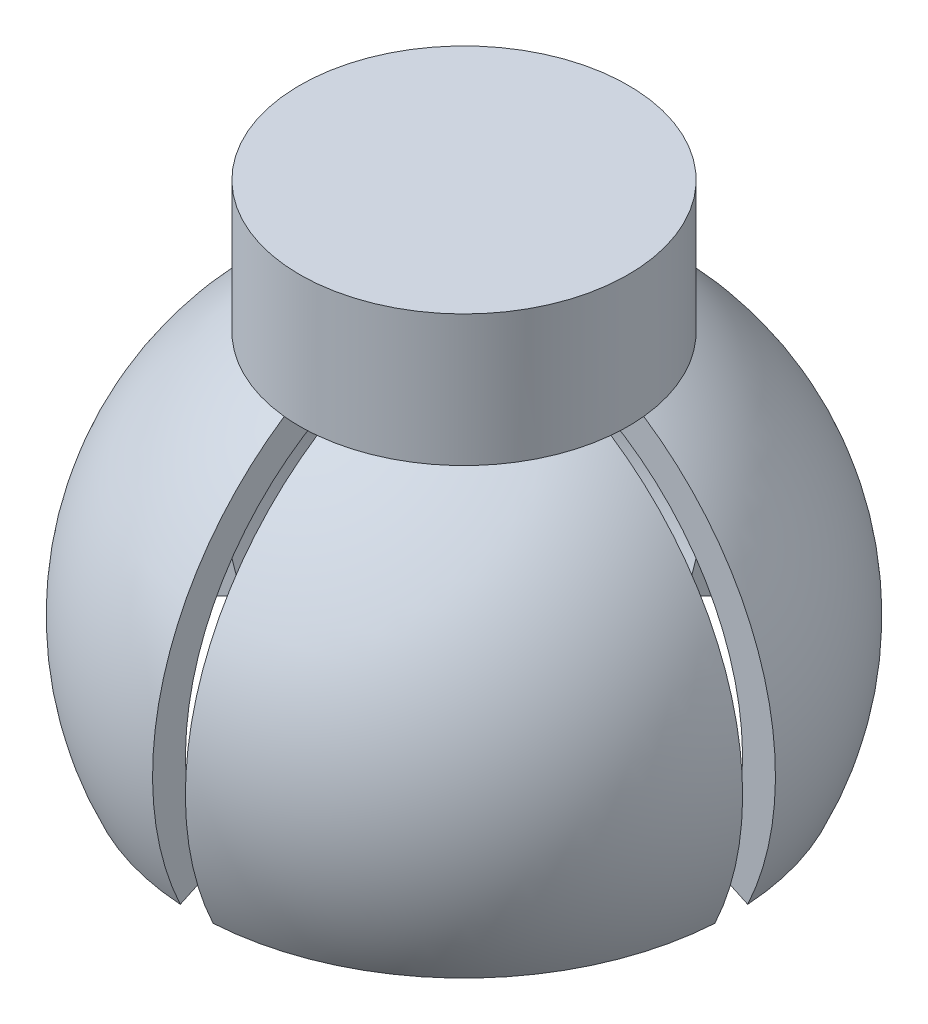
ISO-10303-21;
HEADER;
FILE_DESCRIPTION(('STEP AP214'),'2;1');
FILE_NAME('part.step','',(''),(''),'','','');
FILE_SCHEMA(('AUTOMOTIVE_DESIGN { 1 0 10303 214 1 1 1 1 }'));
ENDSEC;
DATA;
#1=APPLICATION_CONTEXT('core data for automotive mechanical design processes');
#2=APPLICATION_PROTOCOL_DEFINITION('international standard','automotive_design',2000,#1);
#3=PRODUCT_CONTEXT('',#1,'mechanical');
#4=PRODUCT('Part','Part','',(#3));
#5=PRODUCT_RELATED_PRODUCT_CATEGORY('part','',(#4));
#6=PRODUCT_DEFINITION_FORMATION('','',#4);
#7=PRODUCT_DEFINITION_CONTEXT('part definition',#1,'design');
#8=PRODUCT_DEFINITION('design','',#6,#7);
#9=PRODUCT_DEFINITION_SHAPE('','',#8);
#10=(LENGTH_UNIT() NAMED_UNIT(*) SI_UNIT(.MILLI.,.METRE.));
#11=(NAMED_UNIT(*) PLANE_ANGLE_UNIT() SI_UNIT($,.RADIAN.));
#12=(NAMED_UNIT(*) SI_UNIT($,.STERADIAN.) SOLID_ANGLE_UNIT());
#13=UNCERTAINTY_MEASURE_WITH_UNIT(LENGTH_MEASURE(1.E-05),#10,'distance_accuracy_value','');
#14=(GEOMETRIC_REPRESENTATION_CONTEXT(3) GLOBAL_UNCERTAINTY_ASSIGNED_CONTEXT((#13)) GLOBAL_UNIT_ASSIGNED_CONTEXT((#10,
#11,#12)) REPRESENTATION_CONTEXT('',''));
#15=CARTESIAN_POINT('',(0.,0.,0.));
#16=DIRECTION('',(0.,0.,1.));
#17=DIRECTION('',(1.,0.,0.));
#18=AXIS2_PLACEMENT_3D('',#15,#16,#17);
#19=CARTESIAN_POINT('',(0.,-1.6904730469628,0.));
#20=DIRECTION('',(0.,-1.,0.));
#21=DIRECTION('',(0.,0.,-1.));
#22=AXIS2_PLACEMENT_3D('',#19,#20,#21);
#23=CONICAL_SURFACE('',#22,3.6252311481466,1.13446401379632);
#24=CARTESIAN_POINT('',(0.,-1.90178217783315,0.));
#25=DIRECTION('',(0.,1.,0.));
#26=DIRECTION('',(0.,0.,1.));
#27=AXIS2_PLACEMENT_3D('',#24,#25,#26);
#28=CIRCLE('',#27,4.07838504166492);
#29=CARTESIAN_POINT('',(-4.07071548355767,-1.90178217783315,0.250000000000014));
#30=VERTEX_POINT('',#29);
#31=CARTESIAN_POINT('',(-0.25,-1.90178217783315,4.07071548355767));
#32=VERTEX_POINT('',#31);
#33=EDGE_CURVE('E258',#30,#32,#28,.T.);
#34=ORIENTED_EDGE('',*,*,#33,.F.);
#35=CARTESIAN_POINT('',(-4.07221946565592,-1.90248217783315,0.250000000000014));
#36=CARTESIAN_POINT('',(-3.94567931737871,-1.84358642240399,0.250000000000014));
#37=CARTESIAN_POINT('',(-3.81913532048379,-1.78469893906311,0.250000000000014));
#38=CARTESIAN_POINT('',(-3.56603630607503,-1.66694675751874,0.250000000000013));
#39=CARTESIAN_POINT('',(-3.43948128853205,-1.6080820593779,0.250000000000012));
#40=CARTESIAN_POINT('',(-3.05967010023294,-1.43147355775673,0.250000000000011));
#41=CARTESIAN_POINT('',(-2.80639342267716,-1.31377383417764,0.25000000000001));
#42=CARTESIAN_POINT('',(-2.41675898173911,-1.13295021974366,0.250000000000009));
#43=CARTESIAN_POINT('',(-2.28044403311834,-1.06973411557903,0.250000000000008));
#44=CARTESIAN_POINT('',(-2.00775268940997,-0.943431734209146,0.250000000000007));
#45=CARTESIAN_POINT('',(-1.8713762938373,-0.880345458051456,0.250000000000007));
#46=CARTESIAN_POINT('',(-1.59858338414994,-0.75443503519734,0.250000000000006));
#47=CARTESIAN_POINT('',(-1.46216692247366,-0.691610775162603,0.250000000000005));
#48=CARTESIAN_POINT('',(-1.25736353267224,-0.597767490056621,0.250000000000005));
#49=CARTESIAN_POINT('',(-1.18906656722934,-0.566552191028818,0.250000000000004));
#50=CARTESIAN_POINT('',(-1.05237420482607,-0.504338014735132,0.250000000000004));
#51=CARTESIAN_POINT('',(-0.983978808314685,-0.473339136485799,0.250000000000004));
#52=CARTESIAN_POINT('',(-0.855614359830246,-0.415597512203695,0.250000000000003));
#53=CARTESIAN_POINT('',(-0.795665807128812,-0.388809168509848,0.250000000000003));
#54=CARTESIAN_POINT('',(-0.675472957354786,-0.335732884921152,0.250000000000002));
#55=CARTESIAN_POINT('',(-0.61522842343024,-0.309445475553456,0.250000000000002));
#56=CARTESIAN_POINT('',(-0.52506498014929,-0.271120949374287,0.250000000000002));
#57=CARTESIAN_POINT('',(-0.49533245434838,-0.258646616199561,0.250000000000002));
#58=CARTESIAN_POINT('',(-0.435686198997284,-0.234140586402541,0.250000000000002));
#59=CARTESIAN_POINT('',(-0.405772482269082,-0.222108858875767,0.250000000000002));
#60=CARTESIAN_POINT('',(-0.345697431835928,-0.198785670253055,0.250000000000001));
#61=CARTESIAN_POINT('',(-0.315536431927215,-0.187493352493365,0.250000000000001));
#62=CARTESIAN_POINT('',(-0.254773254160907,-0.166179763521121,0.250000000000001));
#63=CARTESIAN_POINT('',(-0.224171405356725,-0.156157593968867,0.250000000000001));
#64=CARTESIAN_POINT('',(-0.17748728721053,-0.142853405188922,0.250000000000001));
#65=CARTESIAN_POINT('',(-0.16166302037817,-0.138680043758284,0.250000000000001));
#66=CARTESIAN_POINT('',(-0.129823790456269,-0.131200750430565,0.250000000000001));
#67=CARTESIAN_POINT('',(-0.113809044577812,-0.127893914121724,0.250000000000001));
#68=CARTESIAN_POINT('',(-0.0814749207414367,-0.122412053874023,0.25));
#69=CARTESIAN_POINT('',(-0.065154260976988,-0.120244271684003,0.25));
#70=CARTESIAN_POINT('',(-0.0323290703377821,-0.117299522118081,0.25));
#71=CARTESIAN_POINT('',(-0.0158240780716583,-0.11652783265685,0.25));
#72=CARTESIAN_POINT('',(0.000700000000000861,-0.116577371519382,0.25));
#73=B_SPLINE_CURVE_WITH_KNOTS('',3,(#35,#36,#37,#38,#39,#40,#41,#42,#43,#44,#45,#46,#47,#48,#49,
#50,#51,#52,#53,#54,#55,#56,#57,#58,#59,#60,#61,#62,#63,#64,#65,#66,#67,#68,#69,#70,#71,#72),
.UNSPECIFIED.,.F.,.F.,(4,2,2,2,2,2,2,2,2,2,2,2,2,2,2,2,2,2,4),(0.,0.41872433554745,
0.837449814219395,1.67531650004867,2.12609617541748,2.57687947391954,3.0274417943241,
3.25271890904912,3.47799499941387,3.67497934292895,3.87216185630467,3.9688900640857,
4.06561150505052,4.16221882798374,4.2587574373911,4.30783604281648,4.35686321790836,
4.40619843202635,4.45571977075776),.UNSPECIFIED.);
#74=CARTESIAN_POINT('',(-3.61660073515066,-1.6904730469628,0.250000000000013));
#75=VERTEX_POINT('',#74);
#76=EDGE_CURVE('E182',#30,#75,#73,.T.);
#77=ORIENTED_EDGE('',*,*,#76,.T.);
#78=CARTESIAN_POINT('',(0.,-1.6904730469628,0.));
#79=DIRECTION('',(0.,1.,0.));
#80=DIRECTION('',(0.,0.,1.));
#81=AXIS2_PLACEMENT_3D('',#78,#79,#80);
#82=CIRCLE('',#81,3.6252311481466);
#83=CARTESIAN_POINT('',(-0.25,-1.6904730469628,3.61660073515066));
#84=VERTEX_POINT('',#83);
#85=EDGE_CURVE('E179',#75,#84,#82,.T.);
#86=ORIENTED_EDGE('',*,*,#85,.T.);
#87=CARTESIAN_POINT('',(-0.25,-0.116577371519382,-0.0007));
#88=CARTESIAN_POINT('',(-0.25,-0.116521368230406,0.0167694577942829));
#89=CARTESIAN_POINT('',(-0.25,-0.117387675628831,0.0342142321475056));
#90=CARTESIAN_POINT('',(-0.25,-0.120671271474661,0.0688866459002576));
#91=CARTESIAN_POINT('',(-0.25,-0.123081964092508,0.0861148925185828));
#92=CARTESIAN_POINT('',(-0.25,-0.129146177088828,0.120229894791217));
#93=CARTESIAN_POINT('',(-0.25,-0.132791875242166,0.13711810784319));
#94=CARTESIAN_POINT('',(-0.25,-0.14100019992691,0.170686937001528));
#95=CARTESIAN_POINT('',(-0.25,-0.145563941428522,0.187367274225319));
#96=CARTESIAN_POINT('',(-0.25,-0.160044091183051,0.236523281885804));
#97=CARTESIAN_POINT('',(-0.25,-0.170879228982749,0.268723854380891));
#98=CARTESIAN_POINT('',(-0.25,-0.193819688373075,0.332674007480803));
#99=CARTESIAN_POINT('',(-0.25,-0.205925868144774,0.364423266731945));
#100=CARTESIAN_POINT('',(-0.25,-0.230865782278105,0.427670148883238));
#101=CARTESIAN_POINT('',(-0.25,-0.243700221632976,0.459167493074044));
#102=CARTESIAN_POINT('',(-0.25,-0.269801042284863,0.52198330457912));
#103=CARTESIAN_POINT('',(-0.25,-0.28306745084794,0.553301760454662));
#104=CARTESIAN_POINT('',(-0.25,-0.323769319525987,0.648250734509752));
#105=CARTESIAN_POINT('',(-0.25,-0.351627548428421,0.711699561803441));
#106=CARTESIAN_POINT('',(-0.25,-0.407829330780213,0.838311787720637));
#107=CARTESIAN_POINT('',(-0.25,-0.436172428513183,0.901475390668849));
#108=CARTESIAN_POINT('',(-0.25,-0.525259785883231,1.09886878378826));
#109=CARTESIAN_POINT('',(-0.25,-0.586484310826681,1.23288168488988));
#110=CARTESIAN_POINT('',(-0.25,-0.709359583895897,1.50071338046139));
#111=CARTESIAN_POINT('',(-0.25,-0.771010339733947,1.63453217136574));
#112=CARTESIAN_POINT('',(-0.25,-0.894559849125209,1.90212538535859));
#113=CARTESIAN_POINT('',(-0.25,-0.956458698077464,2.03589976449549));
#114=CARTESIAN_POINT('',(-0.25,-1.08037491021281,2.30339245029184));
#115=CARTESIAN_POINT('',(-0.25,-1.14239227261557,2.43711075731346));
#116=CARTESIAN_POINT('',(-0.25,-1.32064235124045,2.82117984424759));
#117=CARTESIAN_POINT('',(-0.25,-1.43696284724913,3.07148989045622));
#118=CARTESIAN_POINT('',(-0.25,-1.66968114880864,3.57194065521046));
#119=CARTESIAN_POINT('',(-0.25,-1.78607889814608,3.82208139989095));
#120=CARTESIAN_POINT('',(-0.25,-1.90248217783315,4.07221946565592));
#121=B_SPLINE_CURVE_WITH_KNOTS('',3,(#87,#88,#89,#90,#91,#92,#93,#94,#95,#96,#97,#98,#99,#100,
#101,#102,#103,#104,#105,#106,#107,#108,#109,#110,#111,#112,#113,#114,#115,#116,#117,#118,#119,
#120),.UNSPECIFIED.,.F.,.F.,(4,2,2,2,2,2,2,2,2,2,2,2,2,2,2,2,4),(0.,0.0523449225379201,
0.10446776502531,0.156266461966652,0.208128452796367,0.309988028330286,0.411916825071337,
0.513946035826806,0.615981699237264,0.823860853748743,1.03155433097493,1.47355858361078,
1.91557085497632,2.35777355272897,2.79997334885453,3.6280253125037,4.45571442114346),.UNSPECIFIED.);
#122=EDGE_CURVE('E259',#84,#32,#121,.T.);
#123=ORIENTED_EDGE('',*,*,#122,.T.);
#124=EDGE_LOOP('',(#34,#77,#86,#123));
#125=FACE_BOUND('',#124,.T.);
#126=ADVANCED_FACE('F39',(#125),#23,.F.);
#127=CARTESIAN_POINT('',(0.25,-1.90178217783315,4.07071548355767));
#128=VERTEX_POINT('',#127);
#129=CARTESIAN_POINT('',(4.07071548355768,-1.90178217783315,0.249999999999958));
#130=VERTEX_POINT('',#129);
#131=EDGE_CURVE('E263',#128,#130,#28,.T.);
#132=ORIENTED_EDGE('',*,*,#131,.F.);
#133=CARTESIAN_POINT('',(0.25,-1.90248217783315,4.07221946565592));
#134=CARTESIAN_POINT('',(0.25,-1.84358642240399,3.94567931737871));
#135=CARTESIAN_POINT('',(0.25,-1.78469893906311,3.81913532048379));
#136=CARTESIAN_POINT('',(0.25,-1.66694675751874,3.56603630607503));
#137=CARTESIAN_POINT('',(0.25,-1.6080820593779,3.43948128853205));
#138=CARTESIAN_POINT('',(0.25,-1.43147355775673,3.05967010023294));
#139=CARTESIAN_POINT('',(0.25,-1.31377383417764,2.80639342267715));
#140=CARTESIAN_POINT('',(0.25,-1.13295021974366,2.41675898173911));
#141=CARTESIAN_POINT('',(0.25,-1.06973411557903,2.28044403311834));
#142=CARTESIAN_POINT('',(0.25,-0.943431734209145,2.00775268940997));
#143=CARTESIAN_POINT('',(0.25,-0.880345458051456,1.8713762938373));
#144=CARTESIAN_POINT('',(0.25,-0.75443503519734,1.59858338414994));
#145=CARTESIAN_POINT('',(0.25,-0.691610775162603,1.46216692247366));
#146=CARTESIAN_POINT('',(0.25,-0.597767490056621,1.25736353267224));
#147=CARTESIAN_POINT('',(0.25,-0.566552191028818,1.18906656722935));
#148=CARTESIAN_POINT('',(0.25,-0.504338014735132,1.05237420482607));
#149=CARTESIAN_POINT('',(0.25,-0.4733391364858,0.983978808314686));
#150=CARTESIAN_POINT('',(0.25,-0.415597512203695,0.855614359830247));
#151=CARTESIAN_POINT('',(0.25,-0.388809168509848,0.795665807128813));
#152=CARTESIAN_POINT('',(0.25,-0.335732884921152,0.675472957354787));
#153=CARTESIAN_POINT('',(0.25,-0.309445475553455,0.615228423430241));
#154=CARTESIAN_POINT('',(0.25,-0.271120949374286,0.52506498014929));
#155=CARTESIAN_POINT('',(0.25,-0.258646616199561,0.49533245434838));
#156=CARTESIAN_POINT('',(0.25,-0.234140586402541,0.435686198997284));
#157=CARTESIAN_POINT('',(0.25,-0.222108858875766,0.405772482269082));
#158=CARTESIAN_POINT('',(0.25,-0.198785670253055,0.345697431835928));
#159=CARTESIAN_POINT('',(0.25,-0.187493352493365,0.315536431927215));
#160=CARTESIAN_POINT('',(0.25,-0.166179763521121,0.254773254160908));
#161=CARTESIAN_POINT('',(0.25,-0.156157593968868,0.224171405356726));
#162=CARTESIAN_POINT('',(0.25,-0.142853405188922,0.177487287210531));
#163=CARTESIAN_POINT('',(0.25,-0.138680043758284,0.161663020378171));
#164=CARTESIAN_POINT('',(0.25,-0.131200750430565,0.129823790456271));
#165=CARTESIAN_POINT('',(0.25,-0.127893914121724,0.113809044577813));
#166=CARTESIAN_POINT('',(0.25,-0.122412053874023,0.0814749207414378));
#167=CARTESIAN_POINT('',(0.25,-0.120244271684003,0.0651542609769893));
#168=CARTESIAN_POINT('',(0.25,-0.117299522118081,0.0323290703377834));
#169=CARTESIAN_POINT('',(0.25,-0.11652783265685,0.0158240780716595));
#170=CARTESIAN_POINT('',(0.25,-0.116577371519382,-0.000699999999999942));
#171=B_SPLINE_CURVE_WITH_KNOTS('',3,(#133,#134,#135,#136,#137,#138,#139,#140,#141,#142,#143,
#144,#145,#146,#147,#148,#149,#150,#151,#152,#153,#154,#155,#156,#157,#158,#159,#160,#161,#162,
#163,#164,#165,#166,#167,#168,#169,#170),.UNSPECIFIED.,.F.,.F.,(4,2,2,2,2,2,2,2,2,2,2,2,2,2,2,2,
2,2,4),(0.,0.41872433554745,0.837449814219395,1.67531650004867,2.12609617541748,
2.57687947391954,3.0274417943241,3.25271890904912,3.47799499941387,3.67497934292895,
3.87216185630467,3.9688900640857,4.06561150505052,4.16221882798373,4.2587574373911,
4.30783604281648,4.35686321790835,4.40619843202635,4.45571977075776),.UNSPECIFIED.);
#172=CARTESIAN_POINT('',(0.25,-1.6904730469628,3.61660073515066));
#173=VERTEX_POINT('',#172);
#174=EDGE_CURVE('E404',#128,#173,#171,.T.);
#175=ORIENTED_EDGE('',*,*,#174,.T.);
#176=CARTESIAN_POINT('',(3.61660073515066,-1.6904730469628,0.249999999999962));
#177=VERTEX_POINT('',#176);
#178=EDGE_CURVE('E423',#173,#177,#82,.T.);
#179=ORIENTED_EDGE('',*,*,#178,.T.);
#180=CARTESIAN_POINT('',(-0.000699999999997381,-0.116577371519382,0.25));
#181=CARTESIAN_POINT('',(0.0167694577942855,-0.116521368230406,0.25));
#182=CARTESIAN_POINT('',(0.0342142321475082,-0.117387675628831,0.25));
#183=CARTESIAN_POINT('',(0.0688866459002603,-0.120671271474661,0.249999999999999));
#184=CARTESIAN_POINT('',(0.0861148925185854,-0.123081964092508,0.249999999999999));
#185=CARTESIAN_POINT('',(0.12022989479122,-0.129146177088828,0.249999999999999));
#186=CARTESIAN_POINT('',(0.137118107843192,-0.132791875242166,0.249999999999999));
#187=CARTESIAN_POINT('',(0.170686937001531,-0.14100019992691,0.249999999999998));
#188=CARTESIAN_POINT('',(0.187367274225322,-0.145563941428522,0.249999999999998));
#189=CARTESIAN_POINT('',(0.236523281885807,-0.160044091183051,0.249999999999998));
#190=CARTESIAN_POINT('',(0.268723854380893,-0.170879228982749,0.249999999999997));
#191=CARTESIAN_POINT('',(0.332674007480806,-0.193819688373075,0.249999999999997));
#192=CARTESIAN_POINT('',(0.364423266731948,-0.205925868144774,0.249999999999996));
#193=CARTESIAN_POINT('',(0.427670148883241,-0.230865782278104,0.249999999999996));
#194=CARTESIAN_POINT('',(0.459167493074047,-0.243700221632976,0.249999999999995));
#195=CARTESIAN_POINT('',(0.521983304579123,-0.269801042284863,0.249999999999995));
#196=CARTESIAN_POINT('',(0.553301760454665,-0.28306745084794,0.249999999999994));
#197=CARTESIAN_POINT('',(0.648250734509754,-0.323769319525987,0.249999999999993));
#198=CARTESIAN_POINT('',(0.711699561803444,-0.351627548428421,0.249999999999993));
#199=CARTESIAN_POINT('',(0.838311787720639,-0.407829330780213,0.249999999999991));
#200=CARTESIAN_POINT('',(0.901475390668852,-0.436172428513183,0.249999999999991));
#201=CARTESIAN_POINT('',(1.09886878378827,-0.525259785883231,0.249999999999989));
#202=CARTESIAN_POINT('',(1.23288168488988,-0.586484310826681,0.249999999999987));
#203=CARTESIAN_POINT('',(1.50071338046139,-0.709359583895897,0.249999999999984));
#204=CARTESIAN_POINT('',(1.63453217136574,-0.771010339733946,0.249999999999983));
#205=CARTESIAN_POINT('',(1.90212538535859,-0.894559849125208,0.24999999999998));
#206=CARTESIAN_POINT('',(2.03589976449549,-0.956458698077463,0.249999999999979));
#207=CARTESIAN_POINT('',(2.30339245029184,-1.08037491021281,0.249999999999976));
#208=CARTESIAN_POINT('',(2.43711075731346,-1.14239227261557,0.249999999999975));
#209=CARTESIAN_POINT('',(2.82117984424759,-1.32064235124045,0.249999999999971));
#210=CARTESIAN_POINT('',(3.07148989045622,-1.43696284724913,0.249999999999968));
#211=CARTESIAN_POINT('',(3.57194065521046,-1.66968114880864,0.249999999999963));
#212=CARTESIAN_POINT('',(3.82208139989095,-1.78607889814608,0.24999999999996));
#213=CARTESIAN_POINT('',(4.07221946565592,-1.90248217783315,0.249999999999958));
#214=B_SPLINE_CURVE_WITH_KNOTS('',3,(#180,#181,#182,#183,#184,#185,#186,#187,#188,#189,#190,
#191,#192,#193,#194,#195,#196,#197,#198,#199,#200,#201,#202,#203,#204,#205,#206,#207,#208,#209,
#210,#211,#212,#213),.UNSPECIFIED.,.F.,.F.,(4,2,2,2,2,2,2,2,2,2,2,2,2,2,2,2,4),(0.,
0.0523449225379202,0.10446776502531,0.156266461966652,0.208128452796367,0.309988028330286,
0.411916825071337,0.513946035826805,0.615981699237264,0.823860853748743,1.03155433097493,
1.47355858361078,1.91557085497632,2.35777355272896,2.79997334885453,3.6280253125037,
4.45571442114346),.UNSPECIFIED.);
#215=EDGE_CURVE('E164',#177,#130,#214,.T.);
#216=ORIENTED_EDGE('',*,*,#215,.T.);
#217=EDGE_LOOP('',(#132,#175,#179,#216));
#218=FACE_BOUND('',#217,.T.);
#219=ADVANCED_FACE('F249',(#218),#23,.F.);
#220=CARTESIAN_POINT('',(4.07071548355767,-1.90178217783315,-0.250000000000014));
#221=VERTEX_POINT('',#220);
#222=CARTESIAN_POINT('',(0.25,-1.90178217783315,-4.07071548355767));
#223=VERTEX_POINT('',#222);
#224=EDGE_CURVE('E268',#221,#223,#28,.T.);
#225=ORIENTED_EDGE('',*,*,#224,.F.);
#226=CARTESIAN_POINT('',(4.07221946565592,-1.90248217783315,-0.250000000000014));
#227=CARTESIAN_POINT('',(3.84642018887766,-1.79739993774272,-0.250000000000014));
#228=CARTESIAN_POINT('',(3.62061631904849,-1.69232739864459,-0.250000000000013));
#229=CARTESIAN_POINT('',(3.16892438033937,-1.4822608527627,-0.250000000000011));
#230=CARTESIAN_POINT('',(2.94303630364749,-1.3772668627789,-0.250000000000011));
#231=CARTESIAN_POINT('',(2.50297530959344,-1.17293039869386,-0.250000000000009));
#232=CARTESIAN_POINT('',(2.28880650273163,-1.07357906677326,-0.250000000000008));
#233=CARTESIAN_POINT('',(1.86035862383332,-0.875206011582863,-0.250000000000007));
#234=CARTESIAN_POINT('',(1.64607957572052,-0.776184236797953,-0.250000000000006));
#235=CARTESIAN_POINT('',(1.35410580967115,-0.642073517412084,-0.250000000000005));
#236=CARTESIAN_POINT('',(1.27660865811734,-0.606555186022937,-0.250000000000005));
#237=CARTESIAN_POINT('',(1.121478520418,-0.535738889578691,-0.250000000000004));
#238=CARTESIAN_POINT('',(1.04384549406808,-0.500441012679754,-0.250000000000004));
#239=CARTESIAN_POINT('',(0.886291267358703,-0.429305189961545,-0.250000000000003));
#240=CARTESIAN_POINT('',(0.806364965456739,-0.393478455146141,-0.250000000000003));
#241=CARTESIAN_POINT('',(0.686194276009608,-0.340500361483231,-0.250000000000003));
#242=CARTESIAN_POINT('',(0.646113708642799,-0.322977887121599,-0.250000000000002));
#243=CARTESIAN_POINT('',(0.565775539518348,-0.288343369655277,-0.250000000000002));
#244=CARTESIAN_POINT('',(0.525517943690399,-0.271231312925423,-0.250000000000002));
#245=CARTESIAN_POINT('',(0.44744137708243,-0.238869223429644,-0.250000000000002));
#246=CARTESIAN_POINT('',(0.409642115044455,-0.223571605276977,-0.250000000000002));
#247=CARTESIAN_POINT('',(0.333445270100277,-0.194074198361635,-0.250000000000001));
#248=CARTESIAN_POINT('',(0.295046032927565,-0.179878523848923,-0.250000000000001));
#249=CARTESIAN_POINT('',(0.23753258459872,-0.160695016614375,-0.250000000000001));
#250=CARTESIAN_POINT('',(0.218742414161126,-0.1547493121513,-0.250000000000001));
#251=CARTESIAN_POINT('',(0.180897576071414,-0.143728432106022,-0.250000000000001));
#252=CARTESIAN_POINT('',(0.161842837979899,-0.138653493356956,-0.250000000000001));
#253=CARTESIAN_POINT('',(0.123556318031756,-0.129808797438742,-0.250000000000001));
#254=CARTESIAN_POINT('',(0.104326570061447,-0.126030545344,-0.25));
#255=CARTESIAN_POINT('',(0.0656126591350614,-0.120221995164187,-0.25));
#256=CARTESIAN_POINT('',(0.046128775497585,-0.118189919230773,-0.25));
#257=CARTESIAN_POINT('',(0.000430942099931471,-0.115955224289066,-0.25));
#258=CARTESIAN_POINT('',(-0.0258314589854363,-0.11660331022303,-0.25));
#259=CARTESIAN_POINT('',(-0.0780559332918076,-0.12152997082029,-0.25));
#260=CARTESIAN_POINT('',(-0.104016800357106,-0.125819971466143,-0.25));
#261=CARTESIAN_POINT('',(-0.155968278642699,-0.136969022418902,-0.25));
#262=CARTESIAN_POINT('',(-0.181945729226122,-0.143885117940065,-0.249999999999999));
#263=CARTESIAN_POINT('',(-0.23342532451314,-0.159226735727127,-0.249999999999999));
#264=CARTESIAN_POINT('',(-0.258927618687499,-0.167651774159435,-0.249999999999999));
#265=CARTESIAN_POINT('',(-0.308656865481118,-0.185066631689756,-0.249999999999999));
#266=CARTESIAN_POINT('',(-0.332895668004237,-0.194023213220773,-0.249999999999999));
#267=CARTESIAN_POINT('',(-0.381172154468839,-0.212465722088353,-0.249999999999999));
#268=CARTESIAN_POINT('',(-0.405209817260946,-0.221951704305486,-0.249999999999999));
#269=CARTESIAN_POINT('',(-0.477134186682917,-0.250925488475465,-0.249999999999999));
#270=CARTESIAN_POINT('',(-0.52481453914499,-0.270922560904308,-0.249999999999998));
#271=CARTESIAN_POINT('',(-0.619926669334241,-0.311576238814584,-0.249999999999998));
#272=CARTESIAN_POINT('',(-0.667358259913346,-0.332233275584293,-0.249999999999998));
#273=CARTESIAN_POINT('',(-0.76204860461549,-0.373911729924601,-0.249999999999998));
#274=CARTESIAN_POINT('',(-0.809307394559779,-0.39493306610322,-0.249999999999997));
#275=CARTESIAN_POINT('',(-0.903185136062028,-0.436956476839282,-0.249999999999997));
#276=CARTESIAN_POINT('',(-0.949805223853075,-0.457956022086656,-0.249999999999997));
#277=CARTESIAN_POINT('',(-1.04298321602082,-0.500099788648497,-0.249999999999997));
#278=CARTESIAN_POINT('',(-1.08954111660706,-0.521244018340306,-0.249999999999996));
#279=CARTESIAN_POINT('',(-1.22910333735675,-0.584800682265036,-0.249999999999996));
#280=CARTESIAN_POINT('',(-1.32204178737754,-0.627357634671861,-0.249999999999996));
#281=CARTESIAN_POINT('',(-1.52485845531283,-0.720492072340865,-0.249999999999995));
#282=CARTESIAN_POINT('',(-1.63471829969059,-0.77110949902864,-0.249999999999994));
#283=CARTESIAN_POINT('',(-1.85436748806165,-0.872498964668638,-0.249999999999994));
#284=CARTESIAN_POINT('',(-1.96415683157313,-0.923271004664187,-0.249999999999993));
#285=CARTESIAN_POINT('',(-2.29350518346324,-1.07574263312265,-0.249999999999992));
#286=CARTESIAN_POINT('',(-2.51300137719619,-1.17757784646753,-0.249999999999991));
#287=CARTESIAN_POINT('',(-2.95583175461209,-1.38321706268685,-0.24999999999999));
#288=CARTESIAN_POINT('',(-3.17916465683256,-1.48702382266715,-0.249999999999989));
#289=CARTESIAN_POINT('',(-3.6257404291251,-1.69470965473171,-0.249999999999988));
#290=CARTESIAN_POINT('',(-3.84898330826249,-1.79858870732084,-0.249999999999987));
#291=CARTESIAN_POINT('',(-4.07221946565592,-1.90248217783315,-0.249999999999986));
#292=B_SPLINE_CURVE_WITH_KNOTS('',3,(#226,#227,#228,#229,#230,#231,#232,#233,#234,#235,#236,
#237,#238,#239,#240,#241,#242,#243,#244,#245,#246,#247,#248,#249,#250,#251,#252,#253,#254,#255,
#256,#257,#258,#259,#260,#261,#262,#263,#264,#265,#266,#267,#268,#269,#270,#271,#272,#273,#274,
#275,#276,#277,#278,#279,#280,#281,#282,#283,#284,#285,#286,#287,#288,#289,#290,#291),
.UNSPECIFIED.,.F.,.F.,(4,2,2,2,2,2,2,2,2,2,2,2,2,2,2,2,2,2,2,2,2,2,2,2,2,2,2,2,2,2,2,2,4),(0.,
0.747160296179446,1.49445030053505,2.2027233966672,2.91088002251191,3.16662612724173,
3.42246867916001,3.68523033784669,3.81645985167494,3.94768500286073,4.070013532265,
4.19277877780556,4.25189030697358,4.31101788805231,4.36975036459276,4.42842297227405,
4.50693051172756,4.58568527142497,4.66625891244727,4.74680676411228,4.82431991446648,
4.90184111523785,5.05694022617813,5.21214285591893,5.36731124616735,5.52070500579112,
5.6741077234812,5.98076308903496,6.34364277529268,6.70652491570215,7.43243169065389,
8.17126918582639,8.90995323886443),.UNSPECIFIED.);
#293=CARTESIAN_POINT('',(3.61660073515066,-1.6904730469628,-0.250000000000013));
#294=VERTEX_POINT('',#293);
#295=EDGE_CURVE('E311',#221,#294,#292,.T.);
#296=ORIENTED_EDGE('',*,*,#295,.T.);
#297=CARTESIAN_POINT('',(0.25,-1.6904730469628,-3.61660073515066));
#298=VERTEX_POINT('',#297);
#299=EDGE_CURVE('E267',#294,#298,#82,.T.);
#300=ORIENTED_EDGE('',*,*,#299,.T.);
#301=CARTESIAN_POINT('',(0.25,-0.116577371519382,0.0007));
#302=CARTESIAN_POINT('',(0.25,-0.116521368230406,-0.0167694577942829));
#303=CARTESIAN_POINT('',(0.25,-0.117387675628831,-0.0342142321475056));
#304=CARTESIAN_POINT('',(0.25,-0.120671271474661,-0.0688866459002576));
#305=CARTESIAN_POINT('',(0.25,-0.123081964092508,-0.0861148925185828));
#306=CARTESIAN_POINT('',(0.25,-0.129146177088828,-0.120229894791217));
#307=CARTESIAN_POINT('',(0.25,-0.132791875242166,-0.13711810784319));
#308=CARTESIAN_POINT('',(0.25,-0.14100019992691,-0.170686937001528));
#309=CARTESIAN_POINT('',(0.25,-0.145563941428522,-0.187367274225319));
#310=CARTESIAN_POINT('',(0.25,-0.160044091183051,-0.236523281885804));
#311=CARTESIAN_POINT('',(0.25,-0.170879228982749,-0.268723854380891));
#312=CARTESIAN_POINT('',(0.25,-0.193819688373075,-0.332674007480803));
#313=CARTESIAN_POINT('',(0.25,-0.205925868144774,-0.364423266731945));
#314=CARTESIAN_POINT('',(0.25,-0.230865782278105,-0.427670148883238));
#315=CARTESIAN_POINT('',(0.25,-0.243700221632976,-0.459167493074044));
#316=CARTESIAN_POINT('',(0.25,-0.269801042284863,-0.52198330457912));
#317=CARTESIAN_POINT('',(0.25,-0.28306745084794,-0.553301760454662));
#318=CARTESIAN_POINT('',(0.25,-0.323769319525987,-0.648250734509752));
#319=CARTESIAN_POINT('',(0.25,-0.351627548428421,-0.711699561803441));
#320=CARTESIAN_POINT('',(0.25,-0.407829330780213,-0.838311787720637));
#321=CARTESIAN_POINT('',(0.25,-0.436172428513183,-0.901475390668849));
#322=CARTESIAN_POINT('',(0.25,-0.525259785883231,-1.09886878378826));
#323=CARTESIAN_POINT('',(0.25,-0.586484310826681,-1.23288168488988));
#324=CARTESIAN_POINT('',(0.25,-0.709359583895897,-1.50071338046139));
#325=CARTESIAN_POINT('',(0.25,-0.771010339733947,-1.63453217136574));
#326=CARTESIAN_POINT('',(0.25,-0.894559849125209,-1.90212538535859));
#327=CARTESIAN_POINT('',(0.25,-0.956458698077464,-2.03589976449549));
#328=CARTESIAN_POINT('',(0.25,-1.08037491021281,-2.30339245029184));
#329=CARTESIAN_POINT('',(0.25,-1.14239227261557,-2.43711075731346));
#330=CARTESIAN_POINT('',(0.25,-1.32064235124045,-2.82117984424759));
#331=CARTESIAN_POINT('',(0.25,-1.43696284724913,-3.07148989045622));
#332=CARTESIAN_POINT('',(0.25,-1.66968114880864,-3.57194065521046));
#333=CARTESIAN_POINT('',(0.25,-1.78607889814608,-3.82208139989095));
#334=CARTESIAN_POINT('',(0.25,-1.90248217783315,-4.07221946565592));
#335=B_SPLINE_CURVE_WITH_KNOTS('',3,(#301,#302,#303,#304,#305,#306,#307,#308,#309,#310,#311,
#312,#313,#314,#315,#316,#317,#318,#319,#320,#321,#322,#323,#324,#325,#326,#327,#328,#329,#330,
#331,#332,#333,#334),.UNSPECIFIED.,.F.,.F.,(4,2,2,2,2,2,2,2,2,2,2,2,2,2,2,2,4),(0.,
0.0523449225379201,0.10446776502531,0.156266461966652,0.208128452796367,0.309988028330286,
0.411916825071337,0.513946035826806,0.615981699237264,0.823860853748743,1.03155433097493,
1.47355858361078,1.91557085497632,2.35777355272897,2.79997334885453,3.6280253125037,
4.45571442114346),.UNSPECIFIED.);
#336=EDGE_CURVE('E206',#298,#223,#335,.T.);
#337=ORIENTED_EDGE('',*,*,#336,.T.);
#338=EDGE_LOOP('',(#225,#296,#300,#337));
#339=FACE_BOUND('',#338,.T.);
#340=ADVANCED_FACE('F241',(#339),#23,.F.);
#341=CARTESIAN_POINT('',(0.,0.,0.));
#342=DIRECTION('',(0.,1.,0.));
#343=DIRECTION('',(1.,0.,0.));
#344=AXIS2_PLACEMENT_3D('',#341,#342,#343);
#345=SPHERICAL_SURFACE('',#344,4.5);
#346=CARTESIAN_POINT('',(0.,3.74165738677394,0.));
#347=DIRECTION('',(0.,1.,0.));
#348=DIRECTION('',(0.,0.,1.));
#349=AXIS2_PLACEMENT_3D('',#346,#347,#348);
#350=CIRCLE('',#349,2.5);
#351=CARTESIAN_POINT('',(-2.48746859276655,3.74165738677394,0.250000000000009));
#352=VERTEX_POINT('',#351);
#353=CARTESIAN_POINT('',(-0.25,3.74165738677394,2.48746859276655));
#354=VERTEX_POINT('',#353);
#355=EDGE_CURVE('E438',#352,#354,#350,.T.);
#356=ORIENTED_EDGE('',*,*,#355,.F.);
#357=CARTESIAN_POINT('',(0.,0.,0.25));
#358=DIRECTION('',(0.,0.,1.));
#359=DIRECTION('',(1.,0.,0.));
#360=AXIS2_PLACEMENT_3D('',#357,#358,#359);
#361=CIRCLE('',#360,4.49305018890286);
#362=EDGE_CURVE('E11',#352,#30,#361,.T.);
#363=ORIENTED_EDGE('',*,*,#362,.T.);
#364=ORIENTED_EDGE('',*,*,#33,.T.);
#365=CARTESIAN_POINT('',(-0.25,0.,0.));
#366=DIRECTION('',(-1.,0.,0.));
#367=DIRECTION('',(0.,-1.,0.));
#368=AXIS2_PLACEMENT_3D('',#365,#366,#367);
#369=CIRCLE('',#368,4.49305018890286);
#370=EDGE_CURVE('E290',#32,#354,#369,.T.);
#371=ORIENTED_EDGE('',*,*,#370,.T.);
#372=EDGE_LOOP('',(#356,#363,#364,#371));
#373=FACE_BOUND('',#372,.T.);
#374=ADVANCED_FACE('F235',(#373),#345,.T.);
#375=CARTESIAN_POINT('',(0.25,3.74165738677394,2.48746859276655));
#376=VERTEX_POINT('',#375);
#377=CARTESIAN_POINT('',(2.48746859276655,3.74165738677394,0.249999999999974));
#378=VERTEX_POINT('',#377);
#379=EDGE_CURVE('E327',#376,#378,#350,.T.);
#380=ORIENTED_EDGE('',*,*,#379,.F.);
#381=CARTESIAN_POINT('',(0.25,0.,0.));
#382=DIRECTION('',(1.,0.,0.));
#383=DIRECTION('',(0.,1.,0.));
#384=AXIS2_PLACEMENT_3D('',#381,#382,#383);
#385=CIRCLE('',#384,4.49305018890286);
#386=EDGE_CURVE('E293',#376,#128,#385,.T.);
#387=ORIENTED_EDGE('',*,*,#386,.T.);
#388=ORIENTED_EDGE('',*,*,#131,.T.);
#389=CARTESIAN_POINT('',(0.,0.,0.25));
#390=DIRECTION('',(0.,0.,1.));
#391=DIRECTION('',(1.,0.,0.));
#392=AXIS2_PLACEMENT_3D('',#389,#390,#391);
#393=CIRCLE('',#392,4.49305018890286);
#394=EDGE_CURVE('E286',#130,#378,#393,.T.);
#395=ORIENTED_EDGE('',*,*,#394,.T.);
#396=EDGE_LOOP('',(#380,#387,#388,#395));
#397=FACE_BOUND('',#396,.T.);
#398=ADVANCED_FACE('F244',(#397),#345,.T.);
#399=CARTESIAN_POINT('',(2.48746859276655,3.74165738677394,-0.250000000000009));
#400=VERTEX_POINT('',#399);
#401=CARTESIAN_POINT('',(0.25,3.74165738677394,-2.48746859276655));
#402=VERTEX_POINT('',#401);
#403=EDGE_CURVE('E306',#400,#402,#350,.T.);
#404=ORIENTED_EDGE('',*,*,#403,.F.);
#405=CARTESIAN_POINT('',(0.,0.,-0.25));
#406=DIRECTION('',(0.,0.,-1.));
#407=DIRECTION('',(-1.,0.,0.));
#408=AXIS2_PLACEMENT_3D('',#405,#406,#407);
#409=CIRCLE('',#408,4.49305018890286);
#410=EDGE_CURVE('E48',#400,#221,#409,.T.);
#411=ORIENTED_EDGE('',*,*,#410,.T.);
#412=ORIENTED_EDGE('',*,*,#224,.T.);
#413=CARTESIAN_POINT('',(0.25,0.,0.));
#414=DIRECTION('',(1.,0.,0.));
#415=DIRECTION('',(0.,1.,0.));
#416=AXIS2_PLACEMENT_3D('',#413,#414,#415);
#417=CIRCLE('',#416,4.49305018890286);
#418=EDGE_CURVE('E278',#223,#402,#417,.T.);
#419=ORIENTED_EDGE('',*,*,#418,.T.);
#420=EDGE_LOOP('',(#404,#411,#412,#419));
#421=FACE_BOUND('',#420,.T.);
#422=ADVANCED_FACE('F236',(#421),#345,.T.);
#423=CARTESIAN_POINT('',(2.5,5.74165738677394,0.));
#424=DIRECTION('',(0.,-1.,0.));
#425=DIRECTION('',(0.,0.,-1.));
#426=AXIS2_PLACEMENT_3D('',#423,#424,#425);
#427=PLANE('',#426);
#428=CARTESIAN_POINT('',(0.,5.74165738677394,0.));
#429=DIRECTION('',(0.,1.,0.));
#430=DIRECTION('',(0.,0.,1.));
#431=AXIS2_PLACEMENT_3D('',#428,#429,#430);
#432=CIRCLE('',#431,2.5);
#433=CARTESIAN_POINT('',(0.,5.74165738677394,2.5));
#434=VERTEX_POINT('',#433);
#435=EDGE_CURVE('E324',#434,#434,#432,.T.);
#436=ORIENTED_EDGE('',*,*,#435,.T.);
#437=EDGE_LOOP('',(#436));
#438=FACE_BOUND('',#437,.T.);
#439=ADVANCED_FACE('F41',(#438),#427,.F.);
#440=CARTESIAN_POINT('',(0.,0.,0.));
#441=DIRECTION('',(0.,1.,0.));
#442=DIRECTION('',(-1.,0.,0.));
#443=AXIS2_PLACEMENT_3D('',#440,#441,#442);
#444=SPHERICAL_SURFACE('',#443,4.);
#445=ORIENTED_EDGE('',*,*,#85,.F.);
#446=CARTESIAN_POINT('',(0.,0.,0.25));
#447=DIRECTION('',(0.,0.,1.));
#448=DIRECTION('',(1.,0.,0.));
#449=AXIS2_PLACEMENT_3D('',#446,#447,#448);
#450=CIRCLE('',#449,3.99217985566783);
#451=CARTESIAN_POINT('',(-1.39194109070751,3.74165738677394,0.250000000000005));
#452=VERTEX_POINT('',#451);
#453=EDGE_CURVE('E170',#75,#452,#450,.F.);
#454=ORIENTED_EDGE('',*,*,#453,.T.);
#455=CARTESIAN_POINT('',(0.,3.74165738677394,0.));
#456=DIRECTION('',(0.,1.,0.));
#457=DIRECTION('',(0.,0.,1.));
#458=AXIS2_PLACEMENT_3D('',#455,#456,#457);
#459=CIRCLE('',#458,1.4142135623731);
#460=CARTESIAN_POINT('',(-1.39194109070751,3.74165738677394,-0.249999999999995));
#461=VERTEX_POINT('',#460);
#462=EDGE_CURVE('E153',#452,#461,#459,.F.);
#463=ORIENTED_EDGE('',*,*,#462,.T.);
#464=CARTESIAN_POINT('',(0.,0.,-0.25));
#465=DIRECTION('',(0.,0.,-1.));
#466=DIRECTION('',(-1.,0.,0.));
#467=AXIS2_PLACEMENT_3D('',#464,#465,#466);
#468=CIRCLE('',#467,3.99217985566783);
#469=CARTESIAN_POINT('',(-3.61660073515066,-1.6904730469628,-0.249999999999988));
#470=VERTEX_POINT('',#469);
#471=EDGE_CURVE('E361',#461,#470,#468,.F.);
#472=ORIENTED_EDGE('',*,*,#471,.T.);
#473=CARTESIAN_POINT('',(-0.25,-1.6904730469628,-3.61660073515066));
#474=VERTEX_POINT('',#473);
#475=EDGE_CURVE('E274',#474,#470,#82,.T.);
#476=ORIENTED_EDGE('',*,*,#475,.F.);
#477=CARTESIAN_POINT('',(-0.25,0.,0.));
#478=DIRECTION('',(-1.,0.,0.));
#479=DIRECTION('',(0.,-1.,0.));
#480=AXIS2_PLACEMENT_3D('',#477,#478,#479);
#481=CIRCLE('',#480,3.99217985566783);
#482=CARTESIAN_POINT('',(-0.25,3.74165738677394,-1.39194109070751));
#483=VERTEX_POINT('',#482);
#484=EDGE_CURVE('E329',#474,#483,#481,.F.);
#485=ORIENTED_EDGE('',*,*,#484,.T.);
#486=CARTESIAN_POINT('',(0.,3.74165738677394,0.));
#487=DIRECTION('',(0.,1.,0.));
#488=DIRECTION('',(0.,0.,1.));
#489=AXIS2_PLACEMENT_3D('',#486,#487,#488);
#490=CIRCLE('',#489,1.4142135623731);
#491=CARTESIAN_POINT('',(0.25,3.74165738677394,-1.39194109070751));
#492=VERTEX_POINT('',#491);
#493=EDGE_CURVE('E201',#483,#492,#490,.F.);
#494=ORIENTED_EDGE('',*,*,#493,.T.);
#495=CARTESIAN_POINT('',(0.25,0.,0.));
#496=DIRECTION('',(1.,0.,0.));
#497=DIRECTION('',(0.,1.,0.));
#498=AXIS2_PLACEMENT_3D('',#495,#496,#497);
#499=CIRCLE('',#498,3.99217985566783);
#500=EDGE_CURVE('E215',#492,#298,#499,.F.);
#501=ORIENTED_EDGE('',*,*,#500,.T.);
#502=ORIENTED_EDGE('',*,*,#299,.F.);
#503=CARTESIAN_POINT('',(1.39194109070751,3.74165738677394,-0.250000000000005));
#504=VERTEX_POINT('',#503);
#505=EDGE_CURVE('E189',#294,#504,#468,.F.);
#506=ORIENTED_EDGE('',*,*,#505,.T.);
#507=CARTESIAN_POINT('',(1.39194109070751,3.74165738677394,0.249999999999985));
#508=VERTEX_POINT('',#507);
#509=EDGE_CURVE('E165',#504,#508,#459,.F.);
#510=ORIENTED_EDGE('',*,*,#509,.T.);
#511=CARTESIAN_POINT('',(0.,0.,0.25));
#512=DIRECTION('',(0.,0.,1.));
#513=DIRECTION('',(1.,0.,0.));
#514=AXIS2_PLACEMENT_3D('',#511,#512,#513);
#515=CIRCLE('',#514,3.99217985566783);
#516=EDGE_CURVE('E390',#508,#177,#515,.F.);
#517=ORIENTED_EDGE('',*,*,#516,.T.);
#518=ORIENTED_EDGE('',*,*,#178,.F.);
#519=CARTESIAN_POINT('',(0.25,0.,0.));
#520=DIRECTION('',(1.,0.,0.));
#521=DIRECTION('',(0.,1.,0.));
#522=AXIS2_PLACEMENT_3D('',#519,#520,#521);
#523=CIRCLE('',#522,3.99217985566783);
#524=CARTESIAN_POINT('',(0.25,3.74165738677394,1.39194109070751));
#525=VERTEX_POINT('',#524);
#526=EDGE_CURVE('E362',#173,#525,#523,.F.);
#527=ORIENTED_EDGE('',*,*,#526,.T.);
#528=CARTESIAN_POINT('',(-0.25,3.74165738677394,1.39194109070751));
#529=VERTEX_POINT('',#528);
#530=EDGE_CURVE('E167',#525,#529,#459,.F.);
#531=ORIENTED_EDGE('',*,*,#530,.T.);
#532=CARTESIAN_POINT('',(-0.25,0.,0.));
#533=DIRECTION('',(-1.,0.,0.));
#534=DIRECTION('',(0.,-1.,0.));
#535=AXIS2_PLACEMENT_3D('',#532,#533,#534);
#536=CIRCLE('',#535,3.99217985566783);
#537=EDGE_CURVE('E412',#529,#84,#536,.F.);
#538=ORIENTED_EDGE('',*,*,#537,.T.);
#539=EDGE_LOOP('',(#445,#454,#463,#472,#476,#485,#494,#501,#502,#506,#510,#517,#518,#527,#531,#538));
#540=FACE_BOUND('',#539,.T.);
#541=ADVANCED_FACE('F176',(#540),#444,.F.);
#542=ORIENTED_EDGE('',*,*,#475,.T.);
#543=CARTESIAN_POINT('',(-4.07071548355768,-1.90178217783315,-0.249999999999986));
#544=VERTEX_POINT('',#543);
#545=EDGE_CURVE('E353',#470,#544,#292,.T.);
#546=ORIENTED_EDGE('',*,*,#545,.T.);
#547=CARTESIAN_POINT('',(-0.25,-1.90178217783315,-4.07071548355767));
#548=VERTEX_POINT('',#547);
#549=EDGE_CURVE('E262',#548,#544,#28,.T.);
#550=ORIENTED_EDGE('',*,*,#549,.F.);
#551=CARTESIAN_POINT('',(-0.25,-1.90248217783315,-4.07221946565592));
#552=CARTESIAN_POINT('',(-0.25,-1.84358642240399,-3.94567931737871));
#553=CARTESIAN_POINT('',(-0.25,-1.78469893906311,-3.81913532048379));
#554=CARTESIAN_POINT('',(-0.25,-1.66694675751874,-3.56603630607503));
#555=CARTESIAN_POINT('',(-0.25,-1.6080820593779,-3.43948128853205));
#556=CARTESIAN_POINT('',(-0.25,-1.43147355775673,-3.05967010023294));
#557=CARTESIAN_POINT('',(-0.25,-1.31377383417764,-2.80639342267715));
#558=CARTESIAN_POINT('',(-0.25,-1.13295021974366,-2.41675898173911));
#559=CARTESIAN_POINT('',(-0.25,-1.06973411557903,-2.28044403311834));
#560=CARTESIAN_POINT('',(-0.25,-0.943431734209145,-2.00775268940997));
#561=CARTESIAN_POINT('',(-0.25,-0.880345458051456,-1.8713762938373));
#562=CARTESIAN_POINT('',(-0.25,-0.75443503519734,-1.59858338414994));
#563=CARTESIAN_POINT('',(-0.25,-0.691610775162603,-1.46216692247366));
#564=CARTESIAN_POINT('',(-0.25,-0.597767490056621,-1.25736353267224));
#565=CARTESIAN_POINT('',(-0.25,-0.566552191028818,-1.18906656722935));
#566=CARTESIAN_POINT('',(-0.25,-0.504338014735132,-1.05237420482607));
#567=CARTESIAN_POINT('',(-0.25,-0.4733391364858,-0.983978808314686));
#568=CARTESIAN_POINT('',(-0.25,-0.415597512203695,-0.855614359830247));
#569=CARTESIAN_POINT('',(-0.25,-0.388809168509848,-0.795665807128813));
#570=CARTESIAN_POINT('',(-0.25,-0.335732884921152,-0.675472957354787));
#571=CARTESIAN_POINT('',(-0.25,-0.309445475553455,-0.615228423430241));
#572=CARTESIAN_POINT('',(-0.25,-0.271120949374286,-0.52506498014929));
#573=CARTESIAN_POINT('',(-0.25,-0.258646616199561,-0.49533245434838));
#574=CARTESIAN_POINT('',(-0.25,-0.234140586402541,-0.435686198997284));
#575=CARTESIAN_POINT('',(-0.25,-0.222108858875766,-0.405772482269082));
#576=CARTESIAN_POINT('',(-0.25,-0.198785670253055,-0.345697431835928));
#577=CARTESIAN_POINT('',(-0.25,-0.187493352493365,-0.315536431927215));
#578=CARTESIAN_POINT('',(-0.25,-0.166179763521121,-0.254773254160908));
#579=CARTESIAN_POINT('',(-0.25,-0.156157593968868,-0.224171405356726));
#580=CARTESIAN_POINT('',(-0.25,-0.142853405188922,-0.177487287210531));
#581=CARTESIAN_POINT('',(-0.25,-0.138680043758284,-0.161663020378171));
#582=CARTESIAN_POINT('',(-0.25,-0.131200750430565,-0.129823790456271));
#583=CARTESIAN_POINT('',(-0.25,-0.127893914121724,-0.113809044577813));
#584=CARTESIAN_POINT('',(-0.25,-0.122412053874023,-0.0814749207414378));
#585=CARTESIAN_POINT('',(-0.25,-0.120244271684003,-0.0651542609769893));
#586=CARTESIAN_POINT('',(-0.25,-0.117299522118081,-0.0323290703377834));
#587=CARTESIAN_POINT('',(-0.25,-0.11652783265685,-0.0158240780716595));
#588=CARTESIAN_POINT('',(-0.25,-0.116577371519382,0.000699999999999942));
#589=B_SPLINE_CURVE_WITH_KNOTS('',3,(#551,#552,#553,#554,#555,#556,#557,#558,#559,#560,#561,
#562,#563,#564,#565,#566,#567,#568,#569,#570,#571,#572,#573,#574,#575,#576,#577,#578,#579,#580,
#581,#582,#583,#584,#585,#586,#587,#588),.UNSPECIFIED.,.F.,.F.,(4,2,2,2,2,2,2,2,2,2,2,2,2,2,2,2,
2,2,4),(0.,0.41872433554745,0.837449814219395,1.67531650004867,2.12609617541748,
2.57687947391954,3.0274417943241,3.25271890904912,3.47799499941387,3.67497934292895,
3.87216185630467,3.9688900640857,4.06561150505052,4.16221882798373,4.2587574373911,
4.30783604281648,4.35686321790835,4.40619843202635,4.45571977075776),.UNSPECIFIED.);
#590=EDGE_CURVE('E334',#548,#474,#589,.T.);
#591=ORIENTED_EDGE('',*,*,#590,.T.);
#592=EDGE_LOOP('',(#542,#546,#550,#591));
#593=FACE_BOUND('',#592,.T.);
#594=ADVANCED_FACE('F217',(#593),#23,.F.);
#595=ORIENTED_EDGE('',*,*,#549,.T.);
#596=CARTESIAN_POINT('',(-2.48746859276655,3.74165738677394,-0.249999999999991));
#597=VERTEX_POINT('',#596);
#598=EDGE_CURVE('E296',#544,#597,#409,.T.);
#599=ORIENTED_EDGE('',*,*,#598,.T.);
#600=CARTESIAN_POINT('',(-0.25,3.74165738677394,-2.48746859276655));
#601=VERTEX_POINT('',#600);
#602=EDGE_CURVE('E317',#601,#597,#350,.T.);
#603=ORIENTED_EDGE('',*,*,#602,.F.);
#604=CARTESIAN_POINT('',(-0.25,0.,0.));
#605=DIRECTION('',(-1.,0.,0.));
#606=DIRECTION('',(0.,-1.,0.));
#607=AXIS2_PLACEMENT_3D('',#604,#605,#606);
#608=CIRCLE('',#607,4.49305018890286);
#609=EDGE_CURVE('E282',#601,#548,#608,.T.);
#610=ORIENTED_EDGE('',*,*,#609,.T.);
#611=EDGE_LOOP('',(#595,#599,#603,#610));
#612=FACE_BOUND('',#611,.T.);
#613=ADVANCED_FACE('F231',(#612),#345,.T.);
#614=CARTESIAN_POINT('',(0.,5.74165738677394,0.));
#615=DIRECTION('',(0.,1.,0.));
#616=DIRECTION('',(0.,0.,1.));
#617=AXIS2_PLACEMENT_3D('',#614,#615,#616);
#618=CYLINDRICAL_SURFACE('',#617,2.5);
#619=ORIENTED_EDGE('',*,*,#435,.F.);
#620=EDGE_LOOP('',(#619));
#621=FACE_BOUND('',#620,.T.);
#622=EDGE_CURVE('E272',#402,#601,#350,.T.);
#623=ORIENTED_EDGE('',*,*,#622,.T.);
#624=ORIENTED_EDGE('',*,*,#602,.T.);
#625=EDGE_CURVE('E321',#597,#352,#350,.T.);
#626=ORIENTED_EDGE('',*,*,#625,.T.);
#627=ORIENTED_EDGE('',*,*,#355,.T.);
#628=EDGE_CURVE('E441',#354,#376,#350,.T.);
#629=ORIENTED_EDGE('',*,*,#628,.T.);
#630=ORIENTED_EDGE('',*,*,#379,.T.);
#631=EDGE_CURVE('E323',#378,#400,#350,.T.);
#632=ORIENTED_EDGE('',*,*,#631,.T.);
#633=ORIENTED_EDGE('',*,*,#403,.T.);
#634=EDGE_LOOP('',(#623,#624,#626,#627,#629,#630,#632,#633));
#635=FACE_BOUND('',#634,.T.);
#636=ADVANCED_FACE('F229',(#621,#635),#618,.T.);
#637=CARTESIAN_POINT('',(-0.25,-1.90178217783315,-10.));
#638=DIRECTION('',(-1.,0.,0.));
#639=DIRECTION('',(0.,-1.,0.));
#640=AXIS2_PLACEMENT_3D('',#637,#638,#639);
#641=PLANE('',#640);
#642=ORIENTED_EDGE('',*,*,#590,.F.);
#643=ORIENTED_EDGE('',*,*,#609,.F.);
#644=DIRECTION('',(0.,0.,1.));
#645=VECTOR('',#644,1.);
#646=CARTESIAN_POINT('',(-0.25,3.74165738677394,-10.));
#647=LINE('',#646,#645);
#648=EDGE_CURVE('E187',#601,#483,#647,.T.);
#649=ORIENTED_EDGE('',*,*,#648,.T.);
#650=ORIENTED_EDGE('',*,*,#484,.F.);
#651=EDGE_LOOP('',(#642,#643,#649,#650));
#652=FACE_BOUND('',#651,.T.);
#653=ADVANCED_FACE('F226',(#652),#641,.F.);
#654=CARTESIAN_POINT('',(0.25,-1.90178217783315,-10.));
#655=DIRECTION('',(1.,0.,0.));
#656=DIRECTION('',(0.,1.,0.));
#657=AXIS2_PLACEMENT_3D('',#654,#655,#656);
#658=PLANE('',#657);
#659=DIRECTION('',(0.,0.,1.));
#660=VECTOR('',#659,1.);
#661=CARTESIAN_POINT('',(0.25,3.74165738677394,-10.));
#662=LINE('',#661,#660);
#663=EDGE_CURVE('E181',#402,#492,#662,.T.);
#664=ORIENTED_EDGE('',*,*,#663,.F.);
#665=ORIENTED_EDGE('',*,*,#418,.F.);
#666=ORIENTED_EDGE('',*,*,#336,.F.);
#667=ORIENTED_EDGE('',*,*,#500,.F.);
#668=EDGE_LOOP('',(#664,#665,#666,#667));
#669=FACE_BOUND('',#668,.T.);
#670=ADVANCED_FACE('F220',(#669),#658,.F.);
#671=CARTESIAN_POINT('',(-0.25,3.74165738677394,-10.));
#672=DIRECTION('',(0.,1.,0.));
#673=DIRECTION('',(0.,0.,1.));
#674=AXIS2_PLACEMENT_3D('',#671,#672,#673);
#675=PLANE('',#674);
#676=ORIENTED_EDGE('',*,*,#648,.F.);
#677=ORIENTED_EDGE('',*,*,#622,.F.);
#678=ORIENTED_EDGE('',*,*,#663,.T.);
#679=ORIENTED_EDGE('',*,*,#493,.F.);
#680=EDGE_LOOP('',(#676,#677,#678,#679));
#681=FACE_BOUND('',#680,.T.);
#682=ADVANCED_FACE('F225',(#681),#675,.F.);
#683=CARTESIAN_POINT('',(-10.,3.74165738677394,0.250000000000035));
#684=DIRECTION('',(0.,1.,0.));
#685=DIRECTION('',(0.,0.,1.));
#686=AXIS2_PLACEMENT_3D('',#683,#684,#685);
#687=PLANE('',#686);
#688=DIRECTION('',(0.,0.,-1.));
#689=VECTOR('',#688,1.);
#690=CARTESIAN_POINT('',(0.25,3.74165738677394,10.));
#691=LINE('',#690,#689);
#692=EDGE_CURVE('E63',#376,#525,#691,.T.);
#693=ORIENTED_EDGE('',*,*,#692,.F.);
#694=ORIENTED_EDGE('',*,*,#628,.F.);
#695=DIRECTION('',(0.,0.,-1.));
#696=VECTOR('',#695,1.);
#697=CARTESIAN_POINT('',(-0.25,3.74165738677394,10.));
#698=LINE('',#697,#696);
#699=EDGE_CURVE('E376',#354,#529,#698,.T.);
#700=ORIENTED_EDGE('',*,*,#699,.T.);
#701=ORIENTED_EDGE('',*,*,#530,.F.);
#702=EDGE_LOOP('',(#693,#694,#700,#701));
#703=FACE_BOUND('',#702,.T.);
#704=ADVANCED_FACE('F453',(#703),#687,.F.);
#705=CARTESIAN_POINT('',(-0.25,-1.90178217783315,10.));
#706=DIRECTION('',(-1.,0.,0.));
#707=DIRECTION('',(0.,-1.,0.));
#708=AXIS2_PLACEMENT_3D('',#705,#706,#707);
#709=PLANE('',#708);
#710=ORIENTED_EDGE('',*,*,#699,.F.);
#711=ORIENTED_EDGE('',*,*,#370,.F.);
#712=ORIENTED_EDGE('',*,*,#122,.F.);
#713=ORIENTED_EDGE('',*,*,#537,.F.);
#714=EDGE_LOOP('',(#710,#711,#712,#713));
#715=FACE_BOUND('',#714,.T.);
#716=ADVANCED_FACE('F401',(#715),#709,.F.);
#717=CARTESIAN_POINT('',(0.25,-1.90178217783315,10.));
#718=DIRECTION('',(1.,0.,0.));
#719=DIRECTION('',(0.,1.,0.));
#720=AXIS2_PLACEMENT_3D('',#717,#718,#719);
#721=PLANE('',#720);
#722=ORIENTED_EDGE('',*,*,#174,.F.);
#723=ORIENTED_EDGE('',*,*,#386,.F.);
#724=ORIENTED_EDGE('',*,*,#692,.T.);
#725=ORIENTED_EDGE('',*,*,#526,.F.);
#726=EDGE_LOOP('',(#722,#723,#724,#725));
#727=FACE_BOUND('',#726,.T.);
#728=ADVANCED_FACE('F397',(#727),#721,.F.);
#729=DIRECTION('',(1.,0.,0.));
#730=VECTOR('',#729,1.);
#731=CARTESIAN_POINT('',(-10.,3.74165738677394,0.250000000000035));
#732=LINE('',#731,#730);
#733=EDGE_CURVE('E156',#352,#452,#732,.T.);
#734=ORIENTED_EDGE('',*,*,#733,.F.);
#735=ORIENTED_EDGE('',*,*,#625,.F.);
#736=DIRECTION('',(1.,0.,0.));
#737=VECTOR('',#736,1.);
#738=CARTESIAN_POINT('',(-10.,3.74165738677394,-0.249999999999965));
#739=LINE('',#738,#737);
#740=EDGE_CURVE('E159',#597,#461,#739,.T.);
#741=ORIENTED_EDGE('',*,*,#740,.T.);
#742=ORIENTED_EDGE('',*,*,#462,.F.);
#743=EDGE_LOOP('',(#734,#735,#741,#742));
#744=FACE_BOUND('',#743,.T.);
#745=ADVANCED_FACE('F155',(#744),#687,.F.);
#746=CARTESIAN_POINT('',(-10.,-1.90178217783315,-0.249999999999965));
#747=DIRECTION('',(0.,0.,-1.));
#748=DIRECTION('',(-1.,0.,0.));
#749=AXIS2_PLACEMENT_3D('',#746,#747,#748);
#750=PLANE('',#749);
#751=ORIENTED_EDGE('',*,*,#740,.F.);
#752=ORIENTED_EDGE('',*,*,#598,.F.);
#753=ORIENTED_EDGE('',*,*,#545,.F.);
#754=ORIENTED_EDGE('',*,*,#471,.F.);
#755=EDGE_LOOP('',(#751,#752,#753,#754));
#756=FACE_BOUND('',#755,.T.);
#757=ADVANCED_FACE('F351',(#756),#750,.F.);
#758=CARTESIAN_POINT('',(-10.,-1.90178217783315,0.250000000000035));
#759=DIRECTION('',(0.,0.,1.));
#760=DIRECTION('',(1.,0.,0.));
#761=AXIS2_PLACEMENT_3D('',#758,#759,#760);
#762=PLANE('',#761);
#763=ORIENTED_EDGE('',*,*,#76,.F.);
#764=ORIENTED_EDGE('',*,*,#362,.F.);
#765=ORIENTED_EDGE('',*,*,#733,.T.);
#766=ORIENTED_EDGE('',*,*,#453,.F.);
#767=EDGE_LOOP('',(#763,#764,#765,#766));
#768=FACE_BOUND('',#767,.T.);
#769=ADVANCED_FACE('F169',(#768),#762,.F.);
#770=ORIENTED_EDGE('',*,*,#295,.F.);
#771=ORIENTED_EDGE('',*,*,#410,.F.);
#772=EDGE_CURVE('E55',#504,#400,#739,.T.);
#773=ORIENTED_EDGE('',*,*,#772,.F.);
#774=ORIENTED_EDGE('',*,*,#505,.F.);
#775=EDGE_LOOP('',(#770,#771,#773,#774));
#776=FACE_BOUND('',#775,.T.);
#777=ADVANCED_FACE('F346',(#776),#750,.F.);
#778=CARTESIAN_POINT('',(10.,-1.90178217783315,0.249999999999896));
#779=DIRECTION('',(0.,0.,1.));
#780=DIRECTION('',(1.,0.,0.));
#781=AXIS2_PLACEMENT_3D('',#778,#779,#780);
#782=PLANE('',#781);
#783=DIRECTION('',(-1.,0.,0.));
#784=VECTOR('',#783,1.);
#785=CARTESIAN_POINT('',(10.,3.74165738677394,0.249999999999895));
#786=LINE('',#785,#784);
#787=EDGE_CURVE('E447',#378,#508,#786,.T.);
#788=ORIENTED_EDGE('',*,*,#787,.F.);
#789=ORIENTED_EDGE('',*,*,#394,.F.);
#790=ORIENTED_EDGE('',*,*,#215,.F.);
#791=ORIENTED_EDGE('',*,*,#516,.F.);
#792=EDGE_LOOP('',(#788,#789,#790,#791));
#793=FACE_BOUND('',#792,.T.);
#794=ADVANCED_FACE('F350',(#793),#782,.F.);
#795=ORIENTED_EDGE('',*,*,#772,.T.);
#796=ORIENTED_EDGE('',*,*,#631,.F.);
#797=ORIENTED_EDGE('',*,*,#787,.T.);
#798=ORIENTED_EDGE('',*,*,#509,.F.);
#799=EDGE_LOOP('',(#795,#796,#797,#798));
#800=FACE_BOUND('',#799,.T.);
#801=ADVANCED_FACE('F395',(#800),#687,.F.);
#802=CLOSED_SHELL('',(#126,#219,#340,#374,#398,#422,#439,#541,#594,#613,#636,#653,#670,#682,
#704,#716,#728,#745,#757,#769,#777,#794,#801));
#803=MANIFOLD_SOLID_BREP('B2',#802);
#804=ADVANCED_BREP_SHAPE_REPRESENTATION('',(#18,#803),#14);
#805=SHAPE_DEFINITION_REPRESENTATION(#9,#804);
ENDSEC;
END-ISO-10303-21;
